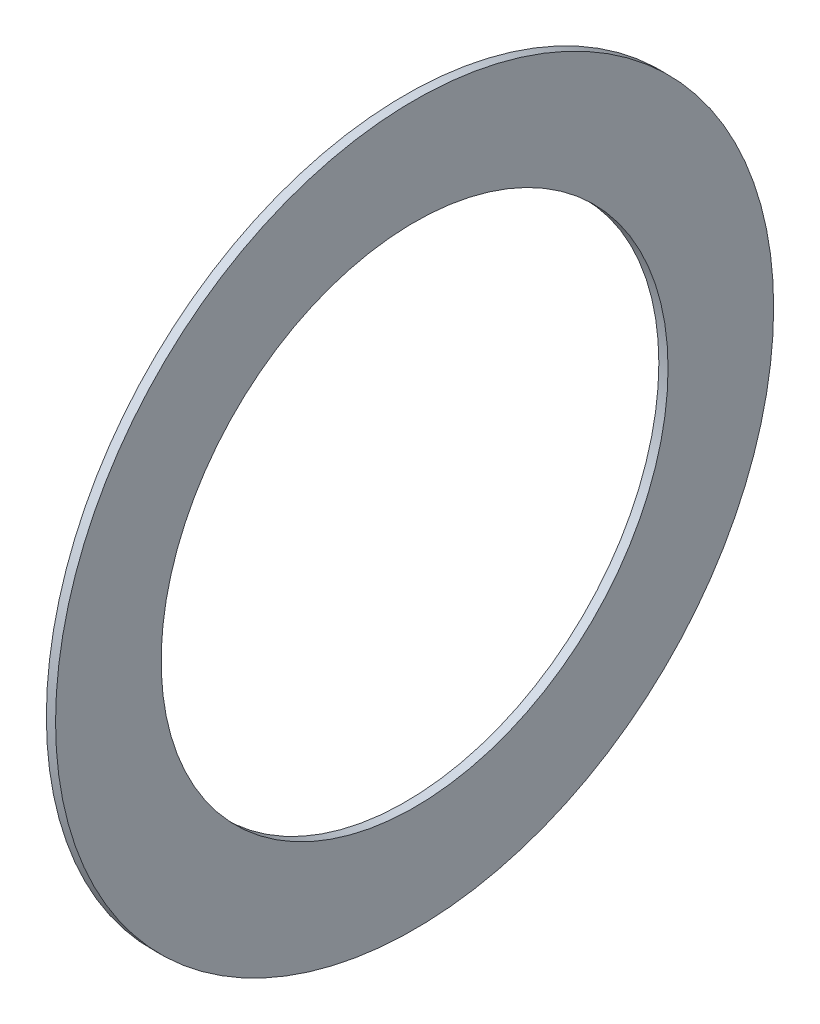
ISO-10303-21;
HEADER;
FILE_DESCRIPTION(('STEP AP214'),'2;1');
FILE_NAME('part.step','',(''),(''),'','','');
FILE_SCHEMA(('AUTOMOTIVE_DESIGN { 1 0 10303 214 1 1 1 1 }'));
ENDSEC;
DATA;
#1=APPLICATION_CONTEXT('core data for automotive mechanical design processes');
#2=APPLICATION_PROTOCOL_DEFINITION('international standard','automotive_design',2000,#1);
#3=PRODUCT_CONTEXT('',#1,'mechanical');
#4=PRODUCT('Part','Part','',(#3));
#5=PRODUCT_RELATED_PRODUCT_CATEGORY('part','',(#4));
#6=PRODUCT_DEFINITION_FORMATION('','',#4);
#7=PRODUCT_DEFINITION_CONTEXT('part definition',#1,'design');
#8=PRODUCT_DEFINITION('design','',#6,#7);
#9=PRODUCT_DEFINITION_SHAPE('','',#8);
#10=(LENGTH_UNIT() NAMED_UNIT(*) SI_UNIT(.MILLI.,.METRE.));
#11=(NAMED_UNIT(*) PLANE_ANGLE_UNIT() SI_UNIT($,.RADIAN.));
#12=(NAMED_UNIT(*) SI_UNIT($,.STERADIAN.) SOLID_ANGLE_UNIT());
#13=UNCERTAINTY_MEASURE_WITH_UNIT(LENGTH_MEASURE(1.E-05),#10,'distance_accuracy_value','');
#14=(GEOMETRIC_REPRESENTATION_CONTEXT(3) GLOBAL_UNCERTAINTY_ASSIGNED_CONTEXT((#13)) GLOBAL_UNIT_ASSIGNED_CONTEXT((#10,
#11,#12)) REPRESENTATION_CONTEXT('',''));
#15=CARTESIAN_POINT('',(0.,0.,0.));
#16=DIRECTION('',(0.,0.,1.));
#17=DIRECTION('',(1.,0.,0.));
#18=AXIS2_PLACEMENT_3D('',#15,#16,#17);
#19=CARTESIAN_POINT('',(0.499999999999976,0.,0.));
#20=DIRECTION('',(1.,0.,0.));
#21=DIRECTION('',(0.,0.,-1.));
#22=AXIS2_PLACEMENT_3D('',#19,#20,#21);
#23=PLANE('',#22);
#24=CARTESIAN_POINT('',(0.499999999999976,0.,0.));
#25=DIRECTION('',(1.,0.,0.));
#26=DIRECTION('',(0.,0.,-1.));
#27=AXIS2_PLACEMENT_3D('',#24,#25,#26);
#28=CIRCLE('',#27,39.);
#29=CARTESIAN_POINT('',(0.499999999999976,0.,-39.));
#30=VERTEX_POINT('',#29);
#31=EDGE_CURVE('E10',#30,#30,#28,.T.);
#32=ORIENTED_EDGE('',*,*,#31,.T.);
#33=EDGE_LOOP('',(#32));
#34=FACE_BOUND('',#33,.T.);
#35=CARTESIAN_POINT('',(0.499999999999976,0.,0.));
#36=DIRECTION('',(1.,0.,0.));
#37=DIRECTION('',(0.,0.,-1.));
#38=AXIS2_PLACEMENT_3D('',#35,#36,#37);
#39=CIRCLE('',#38,27.53);
#40=CARTESIAN_POINT('',(0.499999999999976,0.,-27.53));
#41=VERTEX_POINT('',#40);
#42=EDGE_CURVE('E50',#41,#41,#39,.T.);
#43=ORIENTED_EDGE('',*,*,#42,.F.);
#44=EDGE_LOOP('',(#43));
#45=FACE_BOUND('',#44,.T.);
#46=ADVANCED_FACE('F43',(#34,#45),#23,.T.);
#47=CARTESIAN_POINT('',(0.499999999999976,0.,0.));
#48=DIRECTION('',(-1.,0.,0.));
#49=DIRECTION('',(0.,0.,1.));
#50=AXIS2_PLACEMENT_3D('',#47,#48,#49);
#51=CYLINDRICAL_SURFACE('',#50,39.);
#52=ORIENTED_EDGE('',*,*,#31,.F.);
#53=EDGE_LOOP('',(#52));
#54=FACE_BOUND('',#53,.T.);
#55=CARTESIAN_POINT('',(-0.500000000000024,0.,0.));
#56=DIRECTION('',(1.,0.,0.));
#57=DIRECTION('',(0.,0.,-1.));
#58=AXIS2_PLACEMENT_3D('',#55,#56,#57);
#59=CIRCLE('',#58,39.);
#60=CARTESIAN_POINT('',(-0.500000000000024,0.,-39.));
#61=VERTEX_POINT('',#60);
#62=EDGE_CURVE('E54',#61,#61,#59,.T.);
#63=ORIENTED_EDGE('',*,*,#62,.T.);
#64=EDGE_LOOP('',(#63));
#65=FACE_BOUND('',#64,.T.);
#66=ADVANCED_FACE('F45',(#54,#65),#51,.T.);
#67=CARTESIAN_POINT('',(0.499999999999976,0.,0.));
#68=DIRECTION('',(-1.,0.,0.));
#69=DIRECTION('',(0.,0.,1.));
#70=AXIS2_PLACEMENT_3D('',#67,#68,#69);
#71=CYLINDRICAL_SURFACE('',#70,27.53);
#72=ORIENTED_EDGE('',*,*,#42,.T.);
#73=EDGE_LOOP('',(#72));
#74=FACE_BOUND('',#73,.T.);
#75=CARTESIAN_POINT('',(-0.500000000000024,0.,0.));
#76=DIRECTION('',(1.,0.,0.));
#77=DIRECTION('',(0.,0.,-1.));
#78=AXIS2_PLACEMENT_3D('',#75,#76,#77);
#79=CIRCLE('',#78,27.53);
#80=CARTESIAN_POINT('',(-0.500000000000024,0.,-27.53));
#81=VERTEX_POINT('',#80);
#82=EDGE_CURVE('E58',#81,#81,#79,.T.);
#83=ORIENTED_EDGE('',*,*,#82,.F.);
#84=EDGE_LOOP('',(#83));
#85=FACE_BOUND('',#84,.T.);
#86=ADVANCED_FACE('F67',(#74,#85),#71,.F.);
#87=CARTESIAN_POINT('',(-0.500000000000024,0.,0.));
#88=DIRECTION('',(1.,0.,0.));
#89=DIRECTION('',(0.,0.,-1.));
#90=AXIS2_PLACEMENT_3D('',#87,#88,#89);
#91=PLANE('',#90);
#92=ORIENTED_EDGE('',*,*,#82,.T.);
#93=EDGE_LOOP('',(#92));
#94=FACE_BOUND('',#93,.T.);
#95=ORIENTED_EDGE('',*,*,#62,.F.);
#96=EDGE_LOOP('',(#95));
#97=FACE_BOUND('',#96,.T.);
#98=ADVANCED_FACE('F64',(#94,#97),#91,.F.);
#99=CLOSED_SHELL('',(#46,#66,#86,#98));
#100=MANIFOLD_SOLID_BREP('B2',#99);
#101=ADVANCED_BREP_SHAPE_REPRESENTATION('',(#18,#100),#14);
#102=SHAPE_DEFINITION_REPRESENTATION(#9,#101);
ENDSEC;
END-ISO-10303-21;
